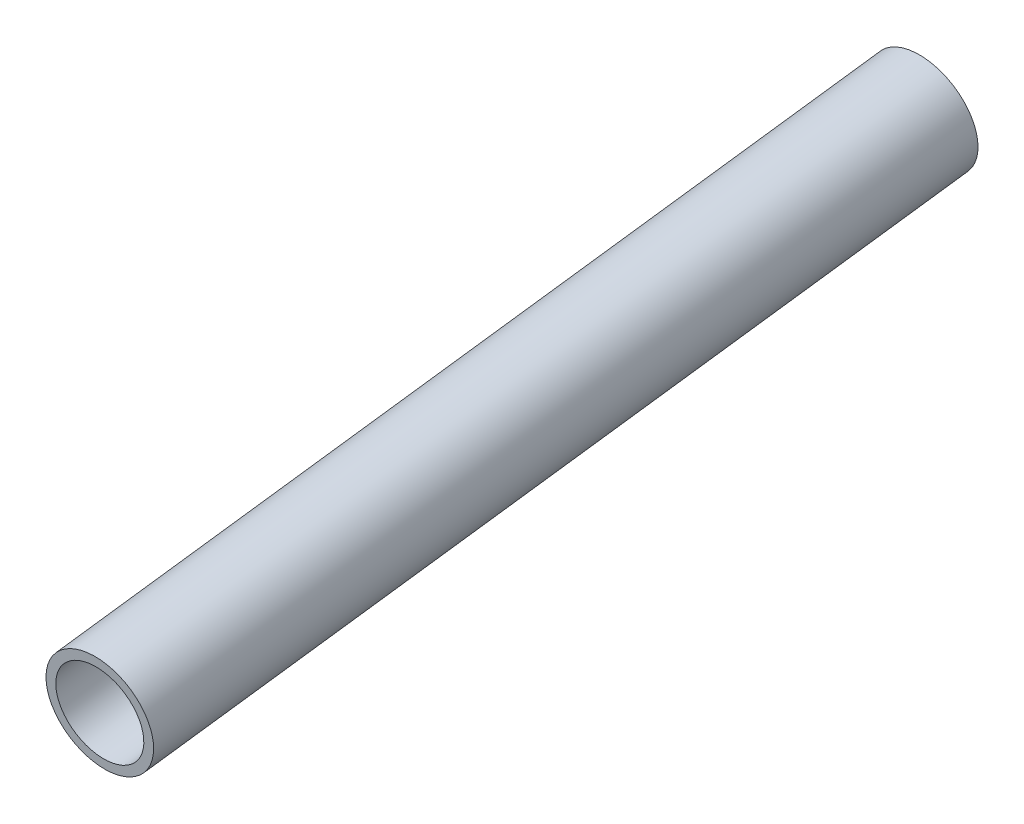
ISO-10303-21;
HEADER;
FILE_DESCRIPTION(('STEP AP214'),'2;1');
FILE_NAME('part.step','',(''),(''),'','','');
FILE_SCHEMA(('AUTOMOTIVE_DESIGN { 1 0 10303 214 1 1 1 1 }'));
ENDSEC;
DATA;
#1=APPLICATION_CONTEXT('core data for automotive mechanical design processes');
#2=APPLICATION_PROTOCOL_DEFINITION('international standard','automotive_design',2000,#1);
#3=PRODUCT_CONTEXT('',#1,'mechanical');
#4=PRODUCT('Part','Part','',(#3));
#5=PRODUCT_RELATED_PRODUCT_CATEGORY('part','',(#4));
#6=PRODUCT_DEFINITION_FORMATION('','',#4);
#7=PRODUCT_DEFINITION_CONTEXT('part definition',#1,'design');
#8=PRODUCT_DEFINITION('design','',#6,#7);
#9=PRODUCT_DEFINITION_SHAPE('','',#8);
#10=(LENGTH_UNIT() NAMED_UNIT(*) SI_UNIT(.MILLI.,.METRE.));
#11=(NAMED_UNIT(*) PLANE_ANGLE_UNIT() SI_UNIT($,.RADIAN.));
#12=(NAMED_UNIT(*) SI_UNIT($,.STERADIAN.) SOLID_ANGLE_UNIT());
#13=UNCERTAINTY_MEASURE_WITH_UNIT(LENGTH_MEASURE(1.E-05),#10,'distance_accuracy_value','');
#14=(GEOMETRIC_REPRESENTATION_CONTEXT(3) GLOBAL_UNCERTAINTY_ASSIGNED_CONTEXT((#13)) GLOBAL_UNIT_ASSIGNED_CONTEXT((#10,
#11,#12)) REPRESENTATION_CONTEXT('',''));
#15=CARTESIAN_POINT('',(0.,0.,0.));
#16=DIRECTION('',(0.,0.,1.));
#17=DIRECTION('',(1.,0.,0.));
#18=AXIS2_PLACEMENT_3D('',#15,#16,#17);
#19=CARTESIAN_POINT('',(-800.261180949901,456.861811966463,222.504243019799));
#20=DIRECTION('',(0.0169356810280855,-0.112029378827996,0.99356056734732));
#21=DIRECTION('',(0.,-0.993703083180682,-0.112045448266347));
#22=AXIS2_PLACEMENT_3D('',#19,#20,#21);
#23=CYLINDRICAL_SURFACE('',#22,6.34999999999992);
#24=CARTESIAN_POINT('',(-799.957007443467,454.849706936544,240.349099752947));
#25=DIRECTION('',(0.0169356810280855,-0.112029378827996,0.99356056734732));
#26=DIRECTION('',(0.,-0.993703083180682,-0.112045448266347));
#27=AXIS2_PLACEMENT_3D('',#24,#25,#26);
#28=CIRCLE('',#27,6.34999999999992);
#29=CARTESIAN_POINT('',(-799.957007443467,448.539692358347,239.637611156455));
#30=VERTEX_POINT('',#29);
#31=EDGE_CURVE('E10',#30,#30,#28,.T.);
#32=ORIENTED_EDGE('',*,*,#31,.T.);
#33=EDGE_LOOP('',(#32));
#34=FACE_BOUND('',#33,.T.);
#35=CARTESIAN_POINT('',(-798.231605217474,443.436186613042,341.572759534721));
#36=DIRECTION('',(-0.0169356810280855,0.112029378827996,-0.99356056734732));
#37=DIRECTION('',(0.,0.993703083180682,0.112045448266347));
#38=AXIS2_PLACEMENT_3D('',#35,#36,#37);
#39=CIRCLE('',#38,6.34999999999992);
#40=CARTESIAN_POINT('',(-798.231605217474,449.74620119124,342.284248131212));
#41=VERTEX_POINT('',#40);
#42=EDGE_CURVE('E38',#41,#41,#39,.F.);
#43=ORIENTED_EDGE('',*,*,#42,.F.);
#44=EDGE_LOOP('',(#43));
#45=FACE_BOUND('',#44,.T.);
#46=ADVANCED_FACE('F31',(#34,#45),#23,.T.);
#47=CARTESIAN_POINT('',(-799.957007443467,454.849706936544,240.349099752947));
#48=DIRECTION('',(0.0169356810280855,-0.112029378827996,0.99356056734732));
#49=DIRECTION('',(0.999856581069563,0.00189756597248771,-0.0168290384533732));
#50=AXIS2_PLACEMENT_3D('',#47,#48,#49);
#51=PLANE('',#50);
#52=CARTESIAN_POINT('',(-799.957007443467,454.849706936544,240.349099752947));
#53=DIRECTION('',(-0.0169356810280855,0.112029378827996,-0.99356056734732));
#54=DIRECTION('',(0.,0.993703083180682,0.112045448266347));
#55=AXIS2_PLACEMENT_3D('',#52,#53,#54);
#56=CIRCLE('',#55,5.19430000000001);
#57=CARTESIAN_POINT('',(-799.957007443467,460.01129886151,240.931097424877));
#58=VERTEX_POINT('',#57);
#59=EDGE_CURVE('E44',#58,#58,#56,.T.);
#60=ORIENTED_EDGE('',*,*,#59,.F.);
#61=EDGE_LOOP('',(#60));
#62=FACE_BOUND('',#61,.T.);
#63=ORIENTED_EDGE('',*,*,#31,.F.);
#64=EDGE_LOOP('',(#63));
#65=FACE_BOUND('',#64,.T.);
#66=ADVANCED_FACE('F60',(#62,#65),#51,.F.);
#67=CARTESIAN_POINT('',(-798.231605217474,443.436186613043,341.572759534721));
#68=DIRECTION('',(-0.0169356810280855,0.112029378827996,-0.99356056734732));
#69=DIRECTION('',(0.999856581069563,0.00189756597248771,-0.0168290384533731));
#70=AXIS2_PLACEMENT_3D('',#67,#68,#69);
#71=PLANE('',#70);
#72=CARTESIAN_POINT('',(-798.231605217474,443.436186613043,341.572759534721));
#73=DIRECTION('',(-0.0169356810280855,0.112029378827996,-0.99356056734732));
#74=DIRECTION('',(0.,0.993703083180682,0.112045448266347));
#75=AXIS2_PLACEMENT_3D('',#72,#73,#74);
#76=CIRCLE('',#75,5.19430000000001);
#77=CARTESIAN_POINT('',(-798.231605217474,448.597778538008,342.154757206651));
#78=VERTEX_POINT('',#77);
#79=EDGE_CURVE('E34',#78,#78,#76,.T.);
#80=ORIENTED_EDGE('',*,*,#79,.T.);
#81=EDGE_LOOP('',(#80));
#82=FACE_BOUND('',#81,.T.);
#83=ORIENTED_EDGE('',*,*,#42,.T.);
#84=EDGE_LOOP('',(#83));
#85=FACE_BOUND('',#84,.T.);
#86=ADVANCED_FACE('F51',(#82,#85),#71,.F.);
#87=CARTESIAN_POINT('',(-798.205705975957,443.264863361586,343.09218264228));
#88=DIRECTION('',(-0.0169356810280855,0.112029378827996,-0.99356056734732));
#89=DIRECTION('',(0.,0.993703083180682,0.112045448266347));
#90=AXIS2_PLACEMENT_3D('',#87,#88,#89);
#91=CYLINDRICAL_SURFACE('',#90,5.19430000000001);
#92=CARTESIAN_POINT('',(-799.957007443467,460.01129886151,240.931097424877));
#93=CARTESIAN_POINT('',(-799.939034503613,459.892408024807,241.985510547603));
#94=CARTESIAN_POINT('',(-799.921061563759,459.773517188103,243.03992367033));
#95=CARTESIAN_POINT('',(-799.885115684051,459.535735514697,245.148749915784));
#96=CARTESIAN_POINT('',(-799.867142744197,459.416844677994,246.203163038511));
#97=CARTESIAN_POINT('',(-799.831196864488,459.179063004588,248.311989283964));
#98=CARTESIAN_POINT('',(-799.813223924634,459.060172167885,249.366402406691));
#99=CARTESIAN_POINT('',(-799.777278044926,458.822390494478,251.475228652145));
#100=CARTESIAN_POINT('',(-799.759305105072,458.703499657775,252.529641774872));
#101=CARTESIAN_POINT('',(-799.723359225364,458.465717984369,254.638468020325));
#102=CARTESIAN_POINT('',(-799.70538628551,458.346827147666,255.692881143052));
#103=CARTESIAN_POINT('',(-799.669440405802,458.109045474259,257.801707388506));
#104=CARTESIAN_POINT('',(-799.651467465947,457.990154637556,258.856120511232));
#105=CARTESIAN_POINT('',(-799.615521586239,457.75237296415,260.964946756686));
#106=CARTESIAN_POINT('',(-799.597548646385,457.633482127447,262.019359879413));
#107=CARTESIAN_POINT('',(-799.561602766677,457.395700454041,264.128186124867));
#108=CARTESIAN_POINT('',(-799.543629826823,457.276809617337,265.182599247593));
#109=CARTESIAN_POINT('',(-799.507683947115,457.039027943931,267.291425493047));
#110=CARTESIAN_POINT('',(-799.489711007261,456.920137107228,268.345838615774));
#111=CARTESIAN_POINT('',(-799.453765127553,456.682355433822,270.454664861227));
#112=CARTESIAN_POINT('',(-799.435792187698,456.563464597118,271.509077983954));
#113=CARTESIAN_POINT('',(-799.39984630799,456.325682923712,273.617904229408));
#114=CARTESIAN_POINT('',(-799.381873368136,456.206792087009,274.672317352135));
#115=CARTESIAN_POINT('',(-799.345927488428,455.969010413603,276.781143597588));
#116=CARTESIAN_POINT('',(-799.327954548574,455.8501195769,277.835556720315));
#117=CARTESIAN_POINT('',(-799.292008668866,455.612337903493,279.944382965769));
#118=CARTESIAN_POINT('',(-799.274035729012,455.49344706679,280.998796088496));
#119=CARTESIAN_POINT('',(-799.238089849303,455.255665393384,283.107622333949));
#120=CARTESIAN_POINT('',(-799.220116909449,455.136774556681,284.162035456676));
#121=CARTESIAN_POINT('',(-799.184171029741,454.898992883275,286.27086170213));
#122=CARTESIAN_POINT('',(-799.166198089887,454.780102046571,287.325274824856));
#123=CARTESIAN_POINT('',(-799.130252210179,454.542320373165,289.43410107031));
#124=CARTESIAN_POINT('',(-799.112279270325,454.423429536462,290.488514193037));
#125=CARTESIAN_POINT('',(-799.076333390617,454.185647863056,292.597340438491));
#126=CARTESIAN_POINT('',(-799.058360450763,454.066757026352,293.651753561217));
#127=CARTESIAN_POINT('',(-799.022414571054,453.828975352946,295.760579806671));
#128=CARTESIAN_POINT('',(-799.0044416312,453.710084516243,296.814992929398));
#129=CARTESIAN_POINT('',(-798.968495751492,453.472302842837,298.923819174851));
#130=CARTESIAN_POINT('',(-798.950522811638,453.353412006134,299.978232297578));
#131=CARTESIAN_POINT('',(-798.91457693193,453.115630332727,302.087058543032));
#132=CARTESIAN_POINT('',(-798.896603992076,452.996739496024,303.141471665759));
#133=CARTESIAN_POINT('',(-798.860658112368,452.758957822618,305.250297911212));
#134=CARTESIAN_POINT('',(-798.842685172513,452.640066985915,306.304711033939));
#135=CARTESIAN_POINT('',(-798.806739292805,452.402285312508,308.413537279393));
#136=CARTESIAN_POINT('',(-798.788766352951,452.283394475805,309.467950402119));
#137=CARTESIAN_POINT('',(-798.752820473243,452.045612802399,311.576776647573));
#138=CARTESIAN_POINT('',(-798.734847533389,451.926721965696,312.6311897703));
#139=CARTESIAN_POINT('',(-798.698901653681,451.68894029229,314.740016015754));
#140=CARTESIAN_POINT('',(-798.680928713827,451.570049455587,315.79442913848));
#141=CARTESIAN_POINT('',(-798.644982834118,451.33226778218,317.903255383934));
#142=CARTESIAN_POINT('',(-798.627009894264,451.213376945477,318.957668506661));
#143=CARTESIAN_POINT('',(-798.591064014556,450.975595272071,321.066494752114));
#144=CARTESIAN_POINT('',(-798.573091074702,450.856704435368,322.120907874841));
#145=CARTESIAN_POINT('',(-798.537145194994,450.618922761961,324.229734120295));
#146=CARTESIAN_POINT('',(-798.51917225514,450.500031925258,325.284147243022));
#147=CARTESIAN_POINT('',(-798.483226375432,450.262250251852,327.392973488475));
#148=CARTESIAN_POINT('',(-798.465253435578,450.143359415149,328.447386611202));
#149=CARTESIAN_POINT('',(-798.429307555869,449.905577741742,330.556212856656));
#150=CARTESIAN_POINT('',(-798.411334616015,449.786686905039,331.610625979383));
#151=CARTESIAN_POINT('',(-798.375388736307,449.548905231633,333.719452224836));
#152=CARTESIAN_POINT('',(-798.357415796453,449.43001439493,334.773865347563));
#153=CARTESIAN_POINT('',(-798.321469916745,449.192232721524,336.882691593017));
#154=CARTESIAN_POINT('',(-798.303496976891,449.07334188482,337.937104715743));
#155=CARTESIAN_POINT('',(-798.267551097183,448.835560211414,340.045930961197));
#156=CARTESIAN_POINT('',(-798.249578157329,448.716669374711,341.100344083924));
#157=CARTESIAN_POINT('',(-798.231605217474,448.597778538008,342.154757206651));
#158=B_SPLINE_CURVE_WITH_KNOTS('',3,(#92,#93,#94,#95,#96,#97,#98,#99,#100,#101,#102,#103,#104,
#105,#106,#107,#108,#109,#110,#111,#112,#113,#114,#115,#116,#117,#118,#119,#120,#121,#122,#123,
#124,#125,#126,#127,#128,#129,#130,#131,#132,#133,#134,#135,#136,#137,#138,#139,#140,#141,#142,
#143,#144,#145,#146,#147,#148,#149,#150,#151,#152,#153,#154,#155,#156,#157),.UNSPECIFIED.,.F.,
.F.,(4,2,2,2,2,2,2,2,2,2,2,2,2,2,2,2,2,2,2,2,2,2,2,2,2,2,2,2,2,2,2,2,4),(0.,3.18374085298683,
6.36748170597365,9.55122255896051,12.7349634119473,15.9187042649341,19.102445117921,
22.2861859709079,25.4699268238947,28.6536676768815,31.8374085298683,35.0211493828552,
38.204890235842,41.3886310888288,44.5723719418157,47.7561127948025,50.9398536477894,
54.1235945007762,57.307335353763,60.4910762067498,63.6748170597367,66.8585579127235,
70.0422987657103,73.2260396186972,76.409780471684,79.5935213246708,82.7772621776577,
85.9610030306445,89.1447438836314,92.3284847366182,95.512225589605,98.6959664425919,
101.879707295579),.UNSPECIFIED.);
#159=EDGE_CURVE('BSEAM54',#58,#78,#158,.T.);
#160=ORIENTED_EDGE('',*,*,#59,.T.);
#161=ORIENTED_EDGE('',*,*,#79,.F.);
#162=ORIENTED_EDGE('',*,*,#159,.T.);
#163=ORIENTED_EDGE('',*,*,#159,.F.);
#164=EDGE_LOOP('',(#160,#162,#161,#163));
#165=FACE_BOUND('',#164,.T.);
#166=ADVANCED_FACE('F54',(#165),#91,.F.);
#167=CLOSED_SHELL('',(#46,#66,#86,#166));
#168=MANIFOLD_SOLID_BREP('B2',#167);
#169=ADVANCED_BREP_SHAPE_REPRESENTATION('',(#18,#168),#14);
#170=SHAPE_DEFINITION_REPRESENTATION(#9,#169);
ENDSEC;
END-ISO-10303-21;
